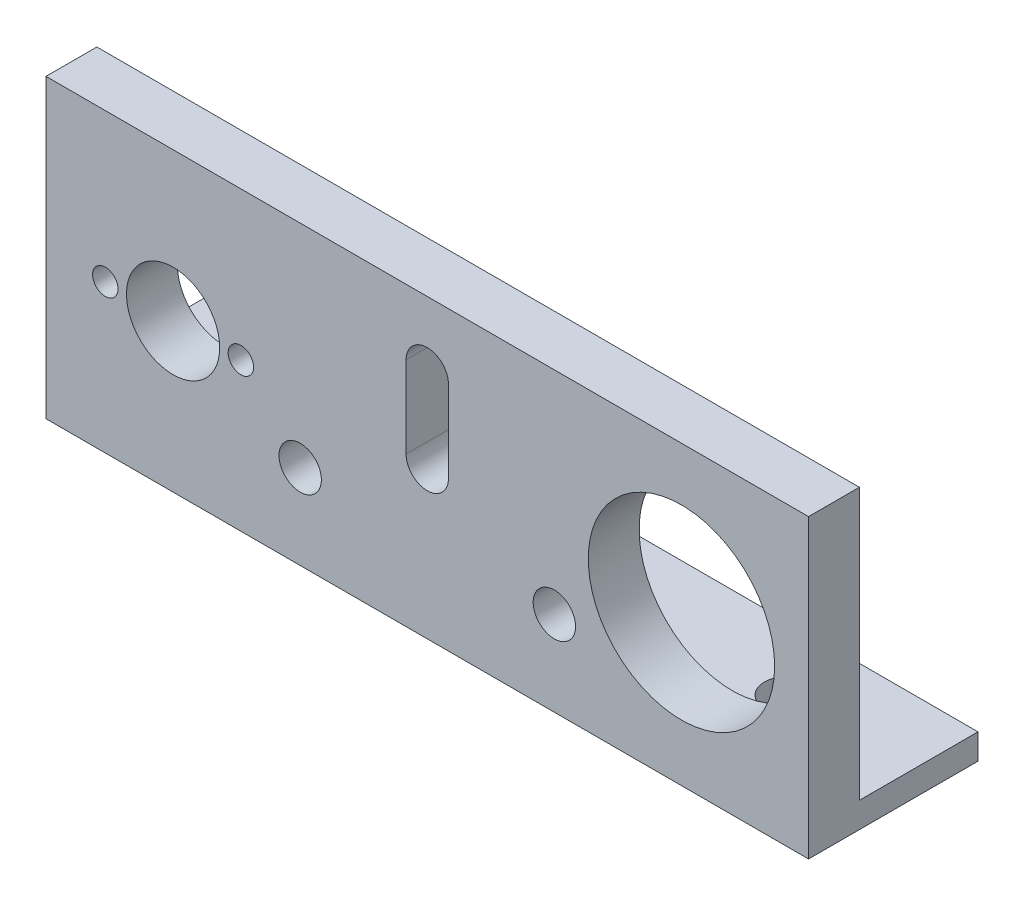
ISO-10303-21;
HEADER;
FILE_DESCRIPTION(('STEP AP214'),'2;1');
FILE_NAME('part.step','',(''),(''),'','','');
FILE_SCHEMA(('AUTOMOTIVE_DESIGN { 1 0 10303 214 1 1 1 1 }'));
ENDSEC;
DATA;
#1=APPLICATION_CONTEXT('core data for automotive mechanical design processes');
#2=APPLICATION_PROTOCOL_DEFINITION('international standard','automotive_design',2000,#1);
#3=PRODUCT_CONTEXT('',#1,'mechanical');
#4=PRODUCT('Part','Part','',(#3));
#5=PRODUCT_RELATED_PRODUCT_CATEGORY('part','',(#4));
#6=PRODUCT_DEFINITION_FORMATION('','',#4);
#7=PRODUCT_DEFINITION_CONTEXT('part definition',#1,'design');
#8=PRODUCT_DEFINITION('design','',#6,#7);
#9=PRODUCT_DEFINITION_SHAPE('','',#8);
#10=(LENGTH_UNIT() NAMED_UNIT(*) SI_UNIT(.MILLI.,.METRE.));
#11=(NAMED_UNIT(*) PLANE_ANGLE_UNIT() SI_UNIT($,.RADIAN.));
#12=(NAMED_UNIT(*) SI_UNIT($,.STERADIAN.) SOLID_ANGLE_UNIT());
#13=UNCERTAINTY_MEASURE_WITH_UNIT(LENGTH_MEASURE(1.E-05),#10,'distance_accuracy_value','');
#14=(GEOMETRIC_REPRESENTATION_CONTEXT(3) GLOBAL_UNCERTAINTY_ASSIGNED_CONTEXT((#13)) GLOBAL_UNIT_ASSIGNED_CONTEXT((#10,
#11,#12)) REPRESENTATION_CONTEXT('',''));
#15=CARTESIAN_POINT('',(0.,0.,0.));
#16=DIRECTION('',(0.,0.,1.));
#17=DIRECTION('',(1.,0.,0.));
#18=AXIS2_PLACEMENT_3D('',#15,#16,#17);
#19=CARTESIAN_POINT('',(0.,0.,6.));
#20=DIRECTION('',(0.,0.,-1.));
#21=DIRECTION('',(-1.,0.,0.));
#22=AXIS2_PLACEMENT_3D('',#19,#20,#21);
#23=PLANE('',#22);
#24=CARTESIAN_POINT('',(15.,-7.49999999999999,6.));
#25=DIRECTION('',(0.,0.,1.));
#26=DIRECTION('',(1.,0.,0.));
#27=AXIS2_PLACEMENT_3D('',#24,#25,#26);
#28=CIRCLE('',#27,2.49999999999999);
#29=CARTESIAN_POINT('',(17.5,-7.49999999999999,6.));
#30=VERTEX_POINT('',#29);
#31=EDGE_CURVE('E215',#30,#30,#28,.T.);
#32=ORIENTED_EDGE('',*,*,#31,.F.);
#33=EDGE_LOOP('',(#32));
#34=FACE_BOUND('',#33,.T.);
#35=CARTESIAN_POINT('',(-15.,-7.49999999999999,6.));
#36=DIRECTION('',(0.,0.,1.));
#37=DIRECTION('',(-1.,0.,0.));
#38=AXIS2_PLACEMENT_3D('',#35,#36,#37);
#39=CIRCLE('',#38,2.5);
#40=CARTESIAN_POINT('',(-17.5,-7.49999999999999,6.));
#41=VERTEX_POINT('',#40);
#42=EDGE_CURVE('E139',#41,#41,#39,.T.);
#43=ORIENTED_EDGE('',*,*,#42,.F.);
#44=EDGE_LOOP('',(#43));
#45=FACE_BOUND('',#44,.T.);
#46=DIRECTION('',(0.,-1.,0.));
#47=VECTOR('',#46,1.);
#48=CARTESIAN_POINT('',(-2.5,9.77898960764086,6.));
#49=LINE('',#48,#47);
#50=CARTESIAN_POINT('',(-2.5,9.77898960764086,6.));
#51=VERTEX_POINT('',#50);
#52=CARTESIAN_POINT('',(-2.49999999999999,0.141519694399124,6.));
#53=VERTEX_POINT('',#52);
#54=EDGE_CURVE('E126',#51,#53,#49,.T.);
#55=ORIENTED_EDGE('',*,*,#54,.F.);
#56=CARTESIAN_POINT('',(0.,9.77898960764086,6.));
#57=DIRECTION('',(0.,0.,1.));
#58=DIRECTION('',(1.,0.,0.));
#59=AXIS2_PLACEMENT_3D('',#56,#57,#58);
#60=CIRCLE('',#59,2.5);
#61=CARTESIAN_POINT('',(2.5,9.77898960764086,6.));
#62=VERTEX_POINT('',#61);
#63=EDGE_CURVE('E53',#62,#51,#60,.T.);
#64=ORIENTED_EDGE('',*,*,#63,.F.);
#65=DIRECTION('',(0.,1.,0.));
#66=VECTOR('',#65,1.);
#67=CARTESIAN_POINT('',(2.5,9.77898960764086,6.));
#68=LINE('',#67,#66);
#69=CARTESIAN_POINT('',(2.5,0.141519694399124,6.));
#70=VERTEX_POINT('',#69);
#71=EDGE_CURVE('E132',#70,#62,#68,.T.);
#72=ORIENTED_EDGE('',*,*,#71,.F.);
#73=CARTESIAN_POINT('',(0.,0.141519694399123,6.));
#74=DIRECTION('',(0.,0.,1.));
#75=DIRECTION('',(1.,0.,0.));
#76=AXIS2_PLACEMENT_3D('',#73,#74,#75);
#77=CIRCLE('',#76,2.5);
#78=EDGE_CURVE('E117',#53,#70,#77,.T.);
#79=ORIENTED_EDGE('',*,*,#78,.F.);
#80=EDGE_LOOP('',(#55,#64,#72,#79));
#81=FACE_BOUND('',#80,.T.);
#82=DIRECTION('',(0.,-1.,0.));
#83=VECTOR('',#82,1.);
#84=CARTESIAN_POINT('',(-45.,-17.5,6.));
#85=LINE('',#84,#83);
#86=CARTESIAN_POINT('',(-45.,17.5,6.));
#87=VERTEX_POINT('',#86);
#88=CARTESIAN_POINT('',(-45.,-17.5,6.));
#89=VERTEX_POINT('',#88);
#90=EDGE_CURVE('E191',#87,#89,#85,.T.);
#91=ORIENTED_EDGE('',*,*,#90,.T.);
#92=DIRECTION('',(1.,0.,0.));
#93=VECTOR('',#92,1.);
#94=CARTESIAN_POINT('',(-45.,-17.5,6.));
#95=LINE('',#94,#93);
#96=CARTESIAN_POINT('',(45.,-17.5,6.));
#97=VERTEX_POINT('',#96);
#98=EDGE_CURVE('E193',#89,#97,#95,.T.);
#99=ORIENTED_EDGE('',*,*,#98,.T.);
#100=DIRECTION('',(0.,1.,0.));
#101=VECTOR('',#100,1.);
#102=CARTESIAN_POINT('',(45.,-17.5,6.));
#103=LINE('',#102,#101);
#104=CARTESIAN_POINT('',(45.,17.5,6.));
#105=VERTEX_POINT('',#104);
#106=EDGE_CURVE('E186',#97,#105,#103,.T.);
#107=ORIENTED_EDGE('',*,*,#106,.T.);
#108=DIRECTION('',(-1.,0.,0.));
#109=VECTOR('',#108,1.);
#110=CARTESIAN_POINT('',(-45.,17.5,6.));
#111=LINE('',#110,#109);
#112=EDGE_CURVE('E188',#105,#87,#111,.T.);
#113=ORIENTED_EDGE('',*,*,#112,.T.);
#114=EDGE_LOOP('',(#91,#99,#107,#113));
#115=FACE_BOUND('',#114,.T.);
#116=CARTESIAN_POINT('',(-30.,0.,6.));
#117=DIRECTION('',(0.,0.,1.));
#118=DIRECTION('',(1.,0.,0.));
#119=AXIS2_PLACEMENT_3D('',#116,#117,#118);
#120=CIRCLE('',#119,5.5);
#121=CARTESIAN_POINT('',(-24.5,0.,6.));
#122=VERTEX_POINT('',#121);
#123=EDGE_CURVE('E180',#122,#122,#120,.T.);
#124=ORIENTED_EDGE('',*,*,#123,.F.);
#125=EDGE_LOOP('',(#124));
#126=FACE_BOUND('',#125,.T.);
#127=CARTESIAN_POINT('',(-38.,0.,6.));
#128=DIRECTION('',(0.,0.,1.));
#129=DIRECTION('',(1.,0.,0.));
#130=AXIS2_PLACEMENT_3D('',#127,#128,#129);
#131=CIRCLE('',#130,1.5);
#132=CARTESIAN_POINT('',(-36.5,0.,6.));
#133=VERTEX_POINT('',#132);
#134=EDGE_CURVE('E174',#133,#133,#131,.T.);
#135=ORIENTED_EDGE('',*,*,#134,.F.);
#136=EDGE_LOOP('',(#135));
#137=FACE_BOUND('',#136,.T.);
#138=CARTESIAN_POINT('',(-22.,0.,6.));
#139=DIRECTION('',(0.,0.,1.));
#140=DIRECTION('',(1.,0.,0.));
#141=AXIS2_PLACEMENT_3D('',#138,#139,#140);
#142=CIRCLE('',#141,1.5);
#143=CARTESIAN_POINT('',(-20.5,0.,6.));
#144=VERTEX_POINT('',#143);
#145=EDGE_CURVE('E168',#144,#144,#142,.T.);
#146=ORIENTED_EDGE('',*,*,#145,.F.);
#147=EDGE_LOOP('',(#146));
#148=FACE_BOUND('',#147,.T.);
#149=CARTESIAN_POINT('',(29.9996666657407,0.200000000000013,6.));
#150=DIRECTION('',(0.,0.,1.));
#151=DIRECTION('',(1.,0.,0.));
#152=AXIS2_PLACEMENT_3D('',#149,#150,#151);
#153=CIRCLE('',#152,11.);
#154=CARTESIAN_POINT('',(40.9996666657407,0.200000000000013,6.));
#155=VERTEX_POINT('',#154);
#156=EDGE_CURVE('E162',#155,#155,#153,.T.);
#157=ORIENTED_EDGE('',*,*,#156,.F.);
#158=EDGE_LOOP('',(#157));
#159=FACE_BOUND('',#158,.T.);
#160=ADVANCED_FACE('F36',(#34,#45,#81,#115,#126,#137,#148,#159),#23,.F.);
#161=CARTESIAN_POINT('',(0.,0.,0.));
#162=DIRECTION('',(0.,0.,-1.));
#163=DIRECTION('',(-1.,0.,0.));
#164=AXIS2_PLACEMENT_3D('',#161,#162,#163);
#165=PLANE('',#164);
#166=CARTESIAN_POINT('',(15.,-7.49999999999999,0.));
#167=DIRECTION('',(0.,0.,-1.));
#168=DIRECTION('',(-1.,0.,0.));
#169=AXIS2_PLACEMENT_3D('',#166,#167,#168);
#170=CIRCLE('',#169,2.49999999999999);
#171=CARTESIAN_POINT('',(12.5,-7.49999999999999,0.));
#172=VERTEX_POINT('',#171);
#173=EDGE_CURVE('E40',#172,#172,#170,.T.);
#174=ORIENTED_EDGE('',*,*,#173,.F.);
#175=EDGE_LOOP('',(#174));
#176=FACE_BOUND('',#175,.T.);
#177=CARTESIAN_POINT('',(-15.,-7.49999999999999,0.));
#178=DIRECTION('',(0.,0.,-1.));
#179=DIRECTION('',(-1.,0.,0.));
#180=AXIS2_PLACEMENT_3D('',#177,#178,#179);
#181=CIRCLE('',#180,2.5);
#182=CARTESIAN_POINT('',(-17.5,-7.49999999999999,0.));
#183=VERTEX_POINT('',#182);
#184=EDGE_CURVE('E213',#183,#183,#181,.T.);
#185=ORIENTED_EDGE('',*,*,#184,.F.);
#186=EDGE_LOOP('',(#185));
#187=FACE_BOUND('',#186,.T.);
#188=CARTESIAN_POINT('',(0.,9.77898960764086,0.));
#189=DIRECTION('',(0.,0.,-1.));
#190=DIRECTION('',(-1.,0.,0.));
#191=AXIS2_PLACEMENT_3D('',#188,#189,#190);
#192=CIRCLE('',#191,2.5);
#193=CARTESIAN_POINT('',(-2.5,9.77898960764086,0.));
#194=VERTEX_POINT('',#193);
#195=CARTESIAN_POINT('',(2.5,9.77898960764086,0.));
#196=VERTEX_POINT('',#195);
#197=EDGE_CURVE('E11',#194,#196,#192,.T.);
#198=ORIENTED_EDGE('',*,*,#197,.F.);
#199=DIRECTION('',(0.,1.,0.));
#200=VECTOR('',#199,1.);
#201=CARTESIAN_POINT('',(-2.49999999999999,0.,0.));
#202=LINE('',#201,#200);
#203=CARTESIAN_POINT('',(-2.49999999999999,0.141519694399124,0.));
#204=VERTEX_POINT('',#203);
#205=EDGE_CURVE('E210',#204,#194,#202,.T.);
#206=ORIENTED_EDGE('',*,*,#205,.F.);
#207=CARTESIAN_POINT('',(0.,0.141519694399123,0.));
#208=DIRECTION('',(0.,0.,-1.));
#209=DIRECTION('',(-1.,0.,0.));
#210=AXIS2_PLACEMENT_3D('',#207,#208,#209);
#211=CIRCLE('',#210,2.5);
#212=CARTESIAN_POINT('',(2.5,0.141519694399124,0.));
#213=VERTEX_POINT('',#212);
#214=EDGE_CURVE('E120',#213,#204,#211,.T.);
#215=ORIENTED_EDGE('',*,*,#214,.F.);
#216=DIRECTION('',(0.,-1.,0.));
#217=VECTOR('',#216,1.);
#218=CARTESIAN_POINT('',(2.5,0.,0.));
#219=LINE('',#218,#217);
#220=EDGE_CURVE('E45',#196,#213,#219,.T.);
#221=ORIENTED_EDGE('',*,*,#220,.F.);
#222=EDGE_LOOP('',(#198,#206,#215,#221));
#223=FACE_BOUND('',#222,.T.);
#224=DIRECTION('',(1.,0.,0.));
#225=VECTOR('',#224,1.);
#226=CARTESIAN_POINT('',(0.,-14.5,0.));
#227=LINE('',#226,#225);
#228=CARTESIAN_POINT('',(-45.,-14.5,0.));
#229=VERTEX_POINT('',#228);
#230=CARTESIAN_POINT('',(45.,-14.5,0.));
#231=VERTEX_POINT('',#230);
#232=EDGE_CURVE('E157',#229,#231,#227,.T.);
#233=ORIENTED_EDGE('',*,*,#232,.F.);
#234=DIRECTION('',(0.,-1.,0.));
#235=VECTOR('',#234,1.);
#236=CARTESIAN_POINT('',(-45.,-17.5,0.));
#237=LINE('',#236,#235);
#238=CARTESIAN_POINT('',(-45.,17.5,0.));
#239=VERTEX_POINT('',#238);
#240=EDGE_CURVE('E189',#239,#229,#237,.T.);
#241=ORIENTED_EDGE('',*,*,#240,.F.);
#242=DIRECTION('',(-1.,0.,0.));
#243=VECTOR('',#242,1.);
#244=CARTESIAN_POINT('',(-45.,17.5,0.));
#245=LINE('',#244,#243);
#246=CARTESIAN_POINT('',(45.,17.5,0.));
#247=VERTEX_POINT('',#246);
#248=EDGE_CURVE('E197',#247,#239,#245,.T.);
#249=ORIENTED_EDGE('',*,*,#248,.F.);
#250=DIRECTION('',(0.,1.,0.));
#251=VECTOR('',#250,1.);
#252=CARTESIAN_POINT('',(45.,-17.5,0.));
#253=LINE('',#252,#251);
#254=EDGE_CURVE('E183',#231,#247,#253,.T.);
#255=ORIENTED_EDGE('',*,*,#254,.F.);
#256=EDGE_LOOP('',(#233,#241,#249,#255));
#257=FACE_BOUND('',#256,.T.);
#258=CARTESIAN_POINT('',(-22.,0.,0.));
#259=DIRECTION('',(0.,0.,1.));
#260=DIRECTION('',(1.,0.,0.));
#261=AXIS2_PLACEMENT_3D('',#258,#259,#260);
#262=CIRCLE('',#261,1.5);
#263=CARTESIAN_POINT('',(-20.5,0.,0.));
#264=VERTEX_POINT('',#263);
#265=EDGE_CURVE('E165',#264,#264,#262,.T.);
#266=ORIENTED_EDGE('',*,*,#265,.T.);
#267=EDGE_LOOP('',(#266));
#268=FACE_BOUND('',#267,.T.);
#269=CARTESIAN_POINT('',(-30.,0.,0.));
#270=DIRECTION('',(0.,0.,1.));
#271=DIRECTION('',(1.,0.,0.));
#272=AXIS2_PLACEMENT_3D('',#269,#270,#271);
#273=CIRCLE('',#272,5.5);
#274=CARTESIAN_POINT('',(-24.5,0.,0.));
#275=VERTEX_POINT('',#274);
#276=EDGE_CURVE('E177',#275,#275,#273,.T.);
#277=ORIENTED_EDGE('',*,*,#276,.T.);
#278=EDGE_LOOP('',(#277));
#279=FACE_BOUND('',#278,.T.);
#280=CARTESIAN_POINT('',(-38.,0.,0.));
#281=DIRECTION('',(0.,0.,1.));
#282=DIRECTION('',(1.,0.,0.));
#283=AXIS2_PLACEMENT_3D('',#280,#281,#282);
#284=CIRCLE('',#283,1.5);
#285=CARTESIAN_POINT('',(-36.5,0.,0.));
#286=VERTEX_POINT('',#285);
#287=EDGE_CURVE('E171',#286,#286,#284,.T.);
#288=ORIENTED_EDGE('',*,*,#287,.T.);
#289=EDGE_LOOP('',(#288));
#290=FACE_BOUND('',#289,.T.);
#291=CARTESIAN_POINT('',(29.9996666657407,0.200000000000013,0.));
#292=DIRECTION('',(0.,0.,1.));
#293=DIRECTION('',(1.,0.,0.));
#294=AXIS2_PLACEMENT_3D('',#291,#292,#293);
#295=CIRCLE('',#294,11.);
#296=CARTESIAN_POINT('',(40.9996666657407,0.200000000000013,0.));
#297=VERTEX_POINT('',#296);
#298=EDGE_CURVE('E161',#297,#297,#295,.T.);
#299=ORIENTED_EDGE('',*,*,#298,.T.);
#300=EDGE_LOOP('',(#299));
#301=FACE_BOUND('',#300,.T.);
#302=ADVANCED_FACE('F260',(#176,#187,#223,#257,#268,#279,#290,#301),#165,.T.);
#303=CARTESIAN_POINT('',(45.,-17.5,6.));
#304=DIRECTION('',(-1.,0.,0.));
#305=DIRECTION('',(0.,0.,1.));
#306=AXIS2_PLACEMENT_3D('',#303,#304,#305);
#307=PLANE('',#306);
#308=DIRECTION('',(0.,0.,-1.));
#309=VECTOR('',#308,1.);
#310=CARTESIAN_POINT('',(45.,17.5,6.));
#311=LINE('',#310,#309);
#312=EDGE_CURVE('E207',#105,#247,#311,.T.);
#313=ORIENTED_EDGE('',*,*,#312,.F.);
#314=ORIENTED_EDGE('',*,*,#106,.F.);
#315=DIRECTION('',(0.,0.,-1.));
#316=VECTOR('',#315,1.);
#317=CARTESIAN_POINT('',(45.,-17.5,6.));
#318=LINE('',#317,#316);
#319=CARTESIAN_POINT('',(45.,-17.5,-14.));
#320=VERTEX_POINT('',#319);
#321=EDGE_CURVE('E195',#97,#320,#318,.T.);
#322=ORIENTED_EDGE('',*,*,#321,.T.);
#323=DIRECTION('',(0.,1.,0.));
#324=VECTOR('',#323,1.);
#325=CARTESIAN_POINT('',(45.,-17.5,-14.));
#326=LINE('',#325,#324);
#327=CARTESIAN_POINT('',(45.,-14.5,-14.));
#328=VERTEX_POINT('',#327);
#329=EDGE_CURVE('E148',#320,#328,#326,.T.);
#330=ORIENTED_EDGE('',*,*,#329,.T.);
#331=DIRECTION('',(0.,0.,1.));
#332=VECTOR('',#331,1.);
#333=CARTESIAN_POINT('',(45.,-14.5,-14.));
#334=LINE('',#333,#332);
#335=EDGE_CURVE('E154',#328,#231,#334,.T.);
#336=ORIENTED_EDGE('',*,*,#335,.T.);
#337=ORIENTED_EDGE('',*,*,#254,.T.);
#338=EDGE_LOOP('',(#313,#314,#322,#330,#336,#337));
#339=FACE_BOUND('',#338,.T.);
#340=ADVANCED_FACE('F38',(#339),#307,.F.);
#341=CARTESIAN_POINT('',(-45.,17.5,6.));
#342=DIRECTION('',(0.,-1.,0.));
#343=DIRECTION('',(0.,0.,-1.));
#344=AXIS2_PLACEMENT_3D('',#341,#342,#343);
#345=PLANE('',#344);
#346=ORIENTED_EDGE('',*,*,#248,.T.);
#347=DIRECTION('',(0.,0.,-1.));
#348=VECTOR('',#347,1.);
#349=CARTESIAN_POINT('',(-45.,17.5,6.));
#350=LINE('',#349,#348);
#351=EDGE_CURVE('E204',#87,#239,#350,.T.);
#352=ORIENTED_EDGE('',*,*,#351,.F.);
#353=ORIENTED_EDGE('',*,*,#112,.F.);
#354=ORIENTED_EDGE('',*,*,#312,.T.);
#355=EDGE_LOOP('',(#346,#352,#353,#354));
#356=FACE_BOUND('',#355,.T.);
#357=ADVANCED_FACE('F269',(#356),#345,.F.);
#358=CARTESIAN_POINT('',(-45.,-17.5,6.));
#359=DIRECTION('',(1.,0.,0.));
#360=DIRECTION('',(0.,0.,-1.));
#361=AXIS2_PLACEMENT_3D('',#358,#359,#360);
#362=PLANE('',#361);
#363=ORIENTED_EDGE('',*,*,#240,.T.);
#364=DIRECTION('',(0.,0.,1.));
#365=VECTOR('',#364,1.);
#366=CARTESIAN_POINT('',(-45.,-14.5,-14.));
#367=LINE('',#366,#365);
#368=CARTESIAN_POINT('',(-45.,-14.5,-14.));
#369=VERTEX_POINT('',#368);
#370=EDGE_CURVE('E155',#369,#229,#367,.T.);
#371=ORIENTED_EDGE('',*,*,#370,.F.);
#372=DIRECTION('',(0.,-1.,0.));
#373=VECTOR('',#372,1.);
#374=CARTESIAN_POINT('',(-45.,-17.5,-14.));
#375=LINE('',#374,#373);
#376=CARTESIAN_POINT('',(-45.,-17.5,-14.));
#377=VERTEX_POINT('',#376);
#378=EDGE_CURVE('E142',#369,#377,#375,.T.);
#379=ORIENTED_EDGE('',*,*,#378,.T.);
#380=DIRECTION('',(0.,0.,-1.));
#381=VECTOR('',#380,1.);
#382=CARTESIAN_POINT('',(-45.,-17.5,6.));
#383=LINE('',#382,#381);
#384=EDGE_CURVE('E202',#89,#377,#383,.T.);
#385=ORIENTED_EDGE('',*,*,#384,.F.);
#386=ORIENTED_EDGE('',*,*,#90,.F.);
#387=ORIENTED_EDGE('',*,*,#351,.T.);
#388=EDGE_LOOP('',(#363,#371,#379,#385,#386,#387));
#389=FACE_BOUND('',#388,.T.);
#390=ADVANCED_FACE('F263',(#389),#362,.F.);
#391=CARTESIAN_POINT('',(-45.,-17.5,6.));
#392=DIRECTION('',(0.,1.,0.));
#393=DIRECTION('',(0.,0.,1.));
#394=AXIS2_PLACEMENT_3D('',#391,#392,#393);
#395=PLANE('',#394);
#396=CARTESIAN_POINT('',(30.,-17.5,-6.5));
#397=DIRECTION('',(0.,1.,0.));
#398=DIRECTION('',(0.,0.,1.));
#399=AXIS2_PLACEMENT_3D('',#396,#397,#398);
#400=CIRCLE('',#399,2.7);
#401=CARTESIAN_POINT('',(30.,-17.5,-3.8));
#402=VERTEX_POINT('',#401);
#403=EDGE_CURVE('E226',#402,#402,#400,.T.);
#404=ORIENTED_EDGE('',*,*,#403,.T.);
#405=EDGE_LOOP('',(#404));
#406=FACE_BOUND('',#405,.T.);
#407=CARTESIAN_POINT('',(-30.,-17.5,-6.5));
#408=DIRECTION('',(0.,1.,0.));
#409=DIRECTION('',(0.,0.,1.));
#410=AXIS2_PLACEMENT_3D('',#407,#408,#409);
#411=CIRCLE('',#410,2.7);
#412=CARTESIAN_POINT('',(-30.,-17.5,-3.8));
#413=VERTEX_POINT('',#412);
#414=EDGE_CURVE('E229',#413,#413,#411,.T.);
#415=ORIENTED_EDGE('',*,*,#414,.T.);
#416=EDGE_LOOP('',(#415));
#417=FACE_BOUND('',#416,.T.);
#418=ORIENTED_EDGE('',*,*,#384,.T.);
#419=DIRECTION('',(1.,0.,0.));
#420=VECTOR('',#419,1.);
#421=CARTESIAN_POINT('',(-45.,-17.5,-14.));
#422=LINE('',#421,#420);
#423=EDGE_CURVE('E145',#377,#320,#422,.T.);
#424=ORIENTED_EDGE('',*,*,#423,.T.);
#425=ORIENTED_EDGE('',*,*,#321,.F.);
#426=ORIENTED_EDGE('',*,*,#98,.F.);
#427=EDGE_LOOP('',(#418,#424,#425,#426));
#428=FACE_BOUND('',#427,.T.);
#429=ADVANCED_FACE('F279',(#406,#417,#428),#395,.F.);
#430=CARTESIAN_POINT('',(-30.,0.,6.));
#431=DIRECTION('',(0.,0.,-1.));
#432=DIRECTION('',(-1.,0.,0.));
#433=AXIS2_PLACEMENT_3D('',#430,#431,#432);
#434=CYLINDRICAL_SURFACE('',#433,5.5);
#435=ORIENTED_EDGE('',*,*,#123,.T.);
#436=EDGE_LOOP('',(#435));
#437=FACE_BOUND('',#436,.T.);
#438=ORIENTED_EDGE('',*,*,#276,.F.);
#439=EDGE_LOOP('',(#438));
#440=FACE_BOUND('',#439,.T.);
#441=ADVANCED_FACE('F310',(#437,#440),#434,.F.);
#442=CARTESIAN_POINT('',(-38.,0.,6.));
#443=DIRECTION('',(0.,0.,-1.));
#444=DIRECTION('',(-1.,0.,0.));
#445=AXIS2_PLACEMENT_3D('',#442,#443,#444);
#446=CYLINDRICAL_SURFACE('',#445,1.5);
#447=ORIENTED_EDGE('',*,*,#134,.T.);
#448=EDGE_LOOP('',(#447));
#449=FACE_BOUND('',#448,.T.);
#450=ORIENTED_EDGE('',*,*,#287,.F.);
#451=EDGE_LOOP('',(#450));
#452=FACE_BOUND('',#451,.T.);
#453=ADVANCED_FACE('F334',(#449,#452),#446,.F.);
#454=CARTESIAN_POINT('',(-22.,0.,6.));
#455=DIRECTION('',(0.,0.,-1.));
#456=DIRECTION('',(-1.,0.,0.));
#457=AXIS2_PLACEMENT_3D('',#454,#455,#456);
#458=CYLINDRICAL_SURFACE('',#457,1.5);
#459=ORIENTED_EDGE('',*,*,#145,.T.);
#460=EDGE_LOOP('',(#459));
#461=FACE_BOUND('',#460,.T.);
#462=ORIENTED_EDGE('',*,*,#265,.F.);
#463=EDGE_LOOP('',(#462));
#464=FACE_BOUND('',#463,.T.);
#465=ADVANCED_FACE('F294',(#461,#464),#458,.F.);
#466=CARTESIAN_POINT('',(29.9996666657407,0.200000000000013,6.));
#467=DIRECTION('',(0.,0.,-1.));
#468=DIRECTION('',(-1.,0.,0.));
#469=AXIS2_PLACEMENT_3D('',#466,#467,#468);
#470=CYLINDRICAL_SURFACE('',#469,11.);
#471=ORIENTED_EDGE('',*,*,#156,.T.);
#472=EDGE_LOOP('',(#471));
#473=FACE_BOUND('',#472,.T.);
#474=ORIENTED_EDGE('',*,*,#298,.F.);
#475=EDGE_LOOP('',(#474));
#476=FACE_BOUND('',#475,.T.);
#477=ADVANCED_FACE('F250',(#473,#476),#470,.F.);
#478=CARTESIAN_POINT('',(-45.,-14.5,-14.));
#479=DIRECTION('',(0.,1.,0.));
#480=DIRECTION('',(0.,0.,1.));
#481=AXIS2_PLACEMENT_3D('',#478,#479,#480);
#482=PLANE('',#481);
#483=CARTESIAN_POINT('',(30.,-14.5,-6.5));
#484=DIRECTION('',(0.,1.,0.));
#485=DIRECTION('',(0.,0.,1.));
#486=AXIS2_PLACEMENT_3D('',#483,#484,#485);
#487=CIRCLE('',#486,2.7);
#488=CARTESIAN_POINT('',(30.,-14.5,-3.8));
#489=VERTEX_POINT('',#488);
#490=EDGE_CURVE('E233',#489,#489,#487,.T.);
#491=ORIENTED_EDGE('',*,*,#490,.F.);
#492=EDGE_LOOP('',(#491));
#493=FACE_BOUND('',#492,.T.);
#494=CARTESIAN_POINT('',(-30.,-14.5,-6.5));
#495=DIRECTION('',(0.,1.,0.));
#496=DIRECTION('',(0.,0.,-1.));
#497=AXIS2_PLACEMENT_3D('',#494,#495,#496);
#498=CIRCLE('',#497,2.7);
#499=CARTESIAN_POINT('',(-30.,-14.5,-9.2));
#500=VERTEX_POINT('',#499);
#501=EDGE_CURVE('E237',#500,#500,#498,.T.);
#502=ORIENTED_EDGE('',*,*,#501,.F.);
#503=EDGE_LOOP('',(#502));
#504=FACE_BOUND('',#503,.T.);
#505=ORIENTED_EDGE('',*,*,#370,.T.);
#506=ORIENTED_EDGE('',*,*,#232,.T.);
#507=ORIENTED_EDGE('',*,*,#335,.F.);
#508=DIRECTION('',(-1.,0.,0.));
#509=VECTOR('',#508,1.);
#510=CARTESIAN_POINT('',(-45.,-14.5,-14.));
#511=LINE('',#510,#509);
#512=EDGE_CURVE('E151',#328,#369,#511,.T.);
#513=ORIENTED_EDGE('',*,*,#512,.T.);
#514=EDGE_LOOP('',(#505,#506,#507,#513));
#515=FACE_BOUND('',#514,.T.);
#516=ADVANCED_FACE('F246',(#493,#504,#515),#482,.T.);
#517=CARTESIAN_POINT('',(0.,0.,-14.));
#518=DIRECTION('',(0.,0.,-1.));
#519=DIRECTION('',(-1.,0.,0.));
#520=AXIS2_PLACEMENT_3D('',#517,#518,#519);
#521=PLANE('',#520);
#522=ORIENTED_EDGE('',*,*,#378,.F.);
#523=ORIENTED_EDGE('',*,*,#512,.F.);
#524=ORIENTED_EDGE('',*,*,#329,.F.);
#525=ORIENTED_EDGE('',*,*,#423,.F.);
#526=EDGE_LOOP('',(#522,#523,#524,#525));
#527=FACE_BOUND('',#526,.T.);
#528=ADVANCED_FACE('F249',(#527),#521,.T.);
#529=CARTESIAN_POINT('',(0.,9.77898960764086,-4.));
#530=DIRECTION('',(0.,0.,1.));
#531=DIRECTION('',(1.,0.,0.));
#532=AXIS2_PLACEMENT_3D('',#529,#530,#531);
#533=CYLINDRICAL_SURFACE('',#532,2.5);
#534=ORIENTED_EDGE('',*,*,#197,.T.);
#535=DIRECTION('',(0.,0.,1.));
#536=VECTOR('',#535,1.);
#537=CARTESIAN_POINT('',(2.5,9.77898960764086,-4.));
#538=LINE('',#537,#536);
#539=EDGE_CURVE('E137',#196,#62,#538,.T.);
#540=ORIENTED_EDGE('',*,*,#539,.T.);
#541=ORIENTED_EDGE('',*,*,#63,.T.);
#542=DIRECTION('',(0.,0.,1.));
#543=VECTOR('',#542,1.);
#544=CARTESIAN_POINT('',(-2.5,9.77898960764086,-4.));
#545=LINE('',#544,#543);
#546=EDGE_CURVE('E123',#194,#51,#545,.T.);
#547=ORIENTED_EDGE('',*,*,#546,.F.);
#548=EDGE_LOOP('',(#534,#540,#541,#547));
#549=FACE_BOUND('',#548,.T.);
#550=ADVANCED_FACE('F362',(#549),#533,.F.);
#551=CARTESIAN_POINT('',(2.5,9.77898960764086,-4.));
#552=DIRECTION('',(1.,0.,0.));
#553=DIRECTION('',(0.,1.,0.));
#554=AXIS2_PLACEMENT_3D('',#551,#552,#553);
#555=PLANE('',#554);
#556=ORIENTED_EDGE('',*,*,#220,.T.);
#557=DIRECTION('',(0.,0.,1.));
#558=VECTOR('',#557,1.);
#559=CARTESIAN_POINT('',(2.5,0.141519694399124,-4.));
#560=LINE('',#559,#558);
#561=EDGE_CURVE('E122',#213,#70,#560,.T.);
#562=ORIENTED_EDGE('',*,*,#561,.T.);
#563=ORIENTED_EDGE('',*,*,#71,.T.);
#564=ORIENTED_EDGE('',*,*,#539,.F.);
#565=EDGE_LOOP('',(#556,#562,#563,#564));
#566=FACE_BOUND('',#565,.T.);
#567=ADVANCED_FACE('F370',(#566),#555,.F.);
#568=CARTESIAN_POINT('',(0.,0.141519694399123,-4.));
#569=DIRECTION('',(0.,0.,1.));
#570=DIRECTION('',(1.,0.,0.));
#571=AXIS2_PLACEMENT_3D('',#568,#569,#570);
#572=CYLINDRICAL_SURFACE('',#571,2.5);
#573=ORIENTED_EDGE('',*,*,#214,.T.);
#574=DIRECTION('',(0.,0.,1.));
#575=VECTOR('',#574,1.);
#576=CARTESIAN_POINT('',(-2.49999999999999,0.141519694399124,-4.));
#577=LINE('',#576,#575);
#578=EDGE_CURVE('E61',#204,#53,#577,.T.);
#579=ORIENTED_EDGE('',*,*,#578,.T.);
#580=ORIENTED_EDGE('',*,*,#78,.T.);
#581=ORIENTED_EDGE('',*,*,#561,.F.);
#582=EDGE_LOOP('',(#573,#579,#580,#581));
#583=FACE_BOUND('',#582,.T.);
#584=ADVANCED_FACE('F114',(#583),#572,.F.);
#585=CARTESIAN_POINT('',(-2.5,9.77898960764086,-4.));
#586=DIRECTION('',(-1.,0.,0.));
#587=DIRECTION('',(0.,-1.,0.));
#588=AXIS2_PLACEMENT_3D('',#585,#586,#587);
#589=PLANE('',#588);
#590=ORIENTED_EDGE('',*,*,#205,.T.);
#591=ORIENTED_EDGE('',*,*,#546,.T.);
#592=ORIENTED_EDGE('',*,*,#54,.T.);
#593=ORIENTED_EDGE('',*,*,#578,.F.);
#594=EDGE_LOOP('',(#590,#591,#592,#593));
#595=FACE_BOUND('',#594,.T.);
#596=ADVANCED_FACE('F127',(#595),#589,.F.);
#597=CARTESIAN_POINT('',(-15.,-7.49999999999999,-4.));
#598=DIRECTION('',(0.,0.,1.));
#599=DIRECTION('',(1.,0.,0.));
#600=AXIS2_PLACEMENT_3D('',#597,#598,#599);
#601=CYLINDRICAL_SURFACE('',#600,2.5);
#602=ORIENTED_EDGE('',*,*,#184,.T.);
#603=EDGE_LOOP('',(#602));
#604=FACE_BOUND('',#603,.T.);
#605=ORIENTED_EDGE('',*,*,#42,.T.);
#606=EDGE_LOOP('',(#605));
#607=FACE_BOUND('',#606,.T.);
#608=ADVANCED_FACE('F390',(#604,#607),#601,.F.);
#609=CARTESIAN_POINT('',(15.,-7.49999999999999,-4.));
#610=DIRECTION('',(0.,0.,1.));
#611=DIRECTION('',(1.,0.,0.));
#612=AXIS2_PLACEMENT_3D('',#609,#610,#611);
#613=CYLINDRICAL_SURFACE('',#612,2.49999999999999);
#614=ORIENTED_EDGE('',*,*,#173,.T.);
#615=EDGE_LOOP('',(#614));
#616=FACE_BOUND('',#615,.T.);
#617=ORIENTED_EDGE('',*,*,#31,.T.);
#618=EDGE_LOOP('',(#617));
#619=FACE_BOUND('',#618,.T.);
#620=ADVANCED_FACE('F397',(#616,#619),#613,.F.);
#621=CARTESIAN_POINT('',(-30.,-24.5,-6.5));
#622=DIRECTION('',(0.,1.,0.));
#623=DIRECTION('',(0.,0.,1.));
#624=AXIS2_PLACEMENT_3D('',#621,#622,#623);
#625=CYLINDRICAL_SURFACE('',#624,2.7);
#626=ORIENTED_EDGE('',*,*,#501,.T.);
#627=EDGE_LOOP('',(#626));
#628=FACE_BOUND('',#627,.T.);
#629=ORIENTED_EDGE('',*,*,#414,.F.);
#630=EDGE_LOOP('',(#629));
#631=FACE_BOUND('',#630,.T.);
#632=ADVANCED_FACE('F243',(#628,#631),#625,.F.);
#633=CARTESIAN_POINT('',(30.,-24.5,-6.5));
#634=DIRECTION('',(0.,1.,0.));
#635=DIRECTION('',(0.,0.,1.));
#636=AXIS2_PLACEMENT_3D('',#633,#634,#635);
#637=CYLINDRICAL_SURFACE('',#636,2.7);
#638=ORIENTED_EDGE('',*,*,#490,.T.);
#639=EDGE_LOOP('',(#638));
#640=FACE_BOUND('',#639,.T.);
#641=ORIENTED_EDGE('',*,*,#403,.F.);
#642=EDGE_LOOP('',(#641));
#643=FACE_BOUND('',#642,.T.);
#644=ADVANCED_FACE('F409',(#640,#643),#637,.F.);
#645=CLOSED_SHELL('',(#160,#302,#340,#357,#390,#429,#441,#453,#465,#477,#516,#528,#550,#567,
#584,#596,#608,#620,#632,#644));
#646=MANIFOLD_SOLID_BREP('B2',#645);
#647=ADVANCED_BREP_SHAPE_REPRESENTATION('',(#18,#646),#14);
#648=SHAPE_DEFINITION_REPRESENTATION(#9,#647);
ENDSEC;
END-ISO-10303-21;
